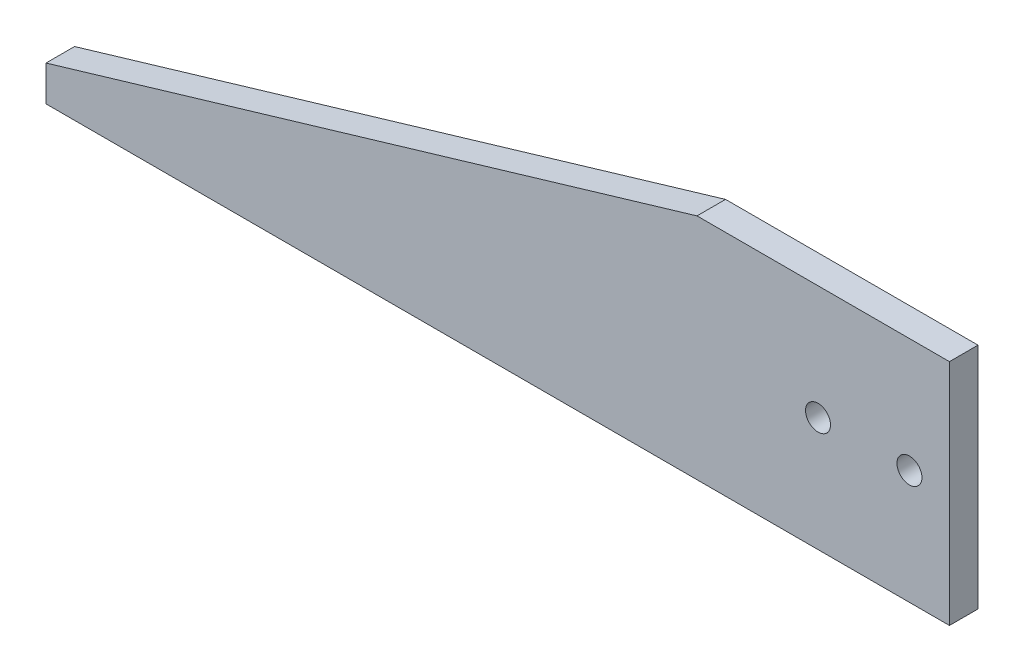
ISO-10303-21;
HEADER;
FILE_DESCRIPTION(('STEP AP214'),'2;1');
FILE_NAME('part.step','',(''),(''),'','','');
FILE_SCHEMA(('AUTOMOTIVE_DESIGN { 1 0 10303 214 1 1 1 1 }'));
ENDSEC;
DATA;
#1=APPLICATION_CONTEXT('core data for automotive mechanical design processes');
#2=APPLICATION_PROTOCOL_DEFINITION('international standard','automotive_design',2000,#1);
#3=PRODUCT_CONTEXT('',#1,'mechanical');
#4=PRODUCT('Part','Part','',(#3));
#5=PRODUCT_RELATED_PRODUCT_CATEGORY('part','',(#4));
#6=PRODUCT_DEFINITION_FORMATION('','',#4);
#7=PRODUCT_DEFINITION_CONTEXT('part definition',#1,'design');
#8=PRODUCT_DEFINITION('design','',#6,#7);
#9=PRODUCT_DEFINITION_SHAPE('','',#8);
#10=(LENGTH_UNIT() NAMED_UNIT(*) SI_UNIT(.MILLI.,.METRE.));
#11=(NAMED_UNIT(*) PLANE_ANGLE_UNIT() SI_UNIT($,.RADIAN.));
#12=(NAMED_UNIT(*) SI_UNIT($,.STERADIAN.) SOLID_ANGLE_UNIT());
#13=UNCERTAINTY_MEASURE_WITH_UNIT(LENGTH_MEASURE(1.E-05),#10,'distance_accuracy_value','');
#14=(GEOMETRIC_REPRESENTATION_CONTEXT(3) GLOBAL_UNCERTAINTY_ASSIGNED_CONTEXT((#13)) GLOBAL_UNIT_ASSIGNED_CONTEXT((#10,
#11,#12)) REPRESENTATION_CONTEXT('',''));
#15=CARTESIAN_POINT('',(0.,0.,0.));
#16=DIRECTION('',(0.,0.,1.));
#17=DIRECTION('',(1.,0.,0.));
#18=AXIS2_PLACEMENT_3D('',#15,#16,#17);
#19=CARTESIAN_POINT('',(-200.836219696139,0.,6.35));
#20=DIRECTION('',(0.,1.,0.));
#21=DIRECTION('',(0.,0.,1.));
#22=AXIS2_PLACEMENT_3D('',#19,#20,#21);
#23=PLANE('',#22);
#24=DIRECTION('',(1.,0.,0.));
#25=VECTOR('',#24,1.);
#26=CARTESIAN_POINT('',(-200.836219696139,0.,0.));
#27=LINE('',#26,#25);
#28=CARTESIAN_POINT('',(-200.836219696139,0.,0.));
#29=VERTEX_POINT('',#28);
#30=CARTESIAN_POINT('',(0.,0.,0.));
#31=VERTEX_POINT('',#30);
#32=EDGE_CURVE('E113',#29,#31,#27,.T.);
#33=ORIENTED_EDGE('',*,*,#32,.T.);
#34=DIRECTION('',(0.,0.,-1.));
#35=VECTOR('',#34,1.);
#36=CARTESIAN_POINT('',(0.,0.,6.35));
#37=LINE('',#36,#35);
#38=CARTESIAN_POINT('',(0.,0.,6.35));
#39=VERTEX_POINT('',#38);
#40=EDGE_CURVE('E11',#39,#31,#37,.T.);
#41=ORIENTED_EDGE('',*,*,#40,.F.);
#42=DIRECTION('',(1.,0.,0.));
#43=VECTOR('',#42,1.);
#44=CARTESIAN_POINT('',(-200.836219696139,0.,6.35));
#45=LINE('',#44,#43);
#46=CARTESIAN_POINT('',(-200.836219696139,0.,6.35));
#47=VERTEX_POINT('',#46);
#48=EDGE_CURVE('E122',#47,#39,#45,.T.);
#49=ORIENTED_EDGE('',*,*,#48,.F.);
#50=DIRECTION('',(0.,0.,-1.));
#51=VECTOR('',#50,1.);
#52=CARTESIAN_POINT('',(-200.836219696139,0.,6.35));
#53=LINE('',#52,#51);
#54=EDGE_CURVE('E109',#47,#29,#53,.T.);
#55=ORIENTED_EDGE('',*,*,#54,.T.);
#56=EDGE_LOOP('',(#33,#41,#49,#55));
#57=FACE_BOUND('',#56,.T.);
#58=ADVANCED_FACE('F39',(#57),#23,.F.);
#59=CARTESIAN_POINT('',(0.,0.,6.35));
#60=DIRECTION('',(-1.,0.,0.));
#61=DIRECTION('',(0.,0.,1.));
#62=AXIS2_PLACEMENT_3D('',#59,#60,#61);
#63=PLANE('',#62);
#64=DIRECTION('',(0.,1.,0.));
#65=VECTOR('',#64,1.);
#66=CARTESIAN_POINT('',(0.,0.,0.));
#67=LINE('',#66,#65);
#68=CARTESIAN_POINT('',(0.,50.8,0.));
#69=VERTEX_POINT('',#68);
#70=EDGE_CURVE('E116',#31,#69,#67,.T.);
#71=ORIENTED_EDGE('',*,*,#70,.T.);
#72=DIRECTION('',(0.,0.,-1.));
#73=VECTOR('',#72,1.);
#74=CARTESIAN_POINT('',(0.,50.8,6.35));
#75=LINE('',#74,#73);
#76=CARTESIAN_POINT('',(0.,50.8,6.35));
#77=VERTEX_POINT('',#76);
#78=EDGE_CURVE('E47',#77,#69,#75,.T.);
#79=ORIENTED_EDGE('',*,*,#78,.F.);
#80=DIRECTION('',(0.,1.,0.));
#81=VECTOR('',#80,1.);
#82=CARTESIAN_POINT('',(0.,0.,6.35));
#83=LINE('',#82,#81);
#84=EDGE_CURVE('E89',#39,#77,#83,.T.);
#85=ORIENTED_EDGE('',*,*,#84,.F.);
#86=ORIENTED_EDGE('',*,*,#40,.T.);
#87=EDGE_LOOP('',(#71,#79,#85,#86));
#88=FACE_BOUND('',#87,.T.);
#89=ADVANCED_FACE('F142',(#88),#63,.F.);
#90=CARTESIAN_POINT('',(0.,50.8,6.35));
#91=DIRECTION('',(0.,-1.,0.));
#92=DIRECTION('',(0.,0.,-1.));
#93=AXIS2_PLACEMENT_3D('',#90,#91,#92);
#94=PLANE('',#93);
#95=DIRECTION('',(-1.,0.,0.));
#96=VECTOR('',#95,1.);
#97=CARTESIAN_POINT('',(0.,50.8,0.));
#98=LINE('',#97,#96);
#99=CARTESIAN_POINT('',(-56.1155095591532,50.8,0.));
#100=VERTEX_POINT('',#99);
#101=EDGE_CURVE('E104',#69,#100,#98,.T.);
#102=ORIENTED_EDGE('',*,*,#101,.T.);
#103=DIRECTION('',(0.,0.,-1.));
#104=VECTOR('',#103,1.);
#105=CARTESIAN_POINT('',(-56.1155095591532,50.8,6.35));
#106=LINE('',#105,#104);
#107=CARTESIAN_POINT('',(-56.1155095591532,50.8,6.35));
#108=VERTEX_POINT('',#107);
#109=EDGE_CURVE('E101',#108,#100,#106,.T.);
#110=ORIENTED_EDGE('',*,*,#109,.F.);
#111=DIRECTION('',(-1.,0.,0.));
#112=VECTOR('',#111,1.);
#113=CARTESIAN_POINT('',(0.,50.8,6.35));
#114=LINE('',#113,#112);
#115=EDGE_CURVE('E93',#77,#108,#114,.T.);
#116=ORIENTED_EDGE('',*,*,#115,.F.);
#117=ORIENTED_EDGE('',*,*,#78,.T.);
#118=EDGE_LOOP('',(#102,#110,#116,#117));
#119=FACE_BOUND('',#118,.T.);
#120=ADVANCED_FACE('F102',(#119),#94,.F.);
#121=CARTESIAN_POINT('',(-56.1155095591532,50.8,6.35));
#122=DIRECTION('',(0.2843946458999,-0.958707299118699,0.));
#123=DIRECTION('',(0.958707299118699,0.2843946458999,0.));
#124=AXIS2_PLACEMENT_3D('',#121,#122,#123);
#125=PLANE('',#124);
#126=DIRECTION('',(-0.958707299118699,-0.2843946458999,0.));
#127=VECTOR('',#126,1.);
#128=CARTESIAN_POINT('',(-56.1155095591532,50.8,0.));
#129=LINE('',#128,#127);
#130=CARTESIAN_POINT('',(-200.836219696139,7.86948809962641,0.));
#131=VERTEX_POINT('',#130);
#132=EDGE_CURVE('E75',#100,#131,#129,.T.);
#133=ORIENTED_EDGE('',*,*,#132,.T.);
#134=DIRECTION('',(0.,0.,-1.));
#135=VECTOR('',#134,1.);
#136=CARTESIAN_POINT('',(-200.836219696139,7.86948809962641,6.35));
#137=LINE('',#136,#135);
#138=CARTESIAN_POINT('',(-200.836219696139,7.86948809962641,6.35));
#139=VERTEX_POINT('',#138);
#140=EDGE_CURVE('E105',#139,#131,#137,.T.);
#141=ORIENTED_EDGE('',*,*,#140,.F.);
#142=DIRECTION('',(-0.958707299118699,-0.2843946458999,0.));
#143=VECTOR('',#142,1.);
#144=CARTESIAN_POINT('',(-56.1155095591532,50.8,6.35));
#145=LINE('',#144,#143);
#146=EDGE_CURVE('E97',#108,#139,#145,.T.);
#147=ORIENTED_EDGE('',*,*,#146,.F.);
#148=ORIENTED_EDGE('',*,*,#109,.T.);
#149=EDGE_LOOP('',(#133,#141,#147,#148));
#150=FACE_BOUND('',#149,.T.);
#151=ADVANCED_FACE('F107',(#150),#125,.F.);
#152=CARTESIAN_POINT('',(-200.836219696139,7.86948809962641,6.35));
#153=DIRECTION('',(1.,0.,0.));
#154=DIRECTION('',(0.,0.,-1.));
#155=AXIS2_PLACEMENT_3D('',#152,#153,#154);
#156=PLANE('',#155);
#157=DIRECTION('',(0.,-1.,0.));
#158=VECTOR('',#157,1.);
#159=CARTESIAN_POINT('',(-200.836219696139,7.86948809962641,0.));
#160=LINE('',#159,#158);
#161=EDGE_CURVE('E81',#131,#29,#160,.T.);
#162=ORIENTED_EDGE('',*,*,#161,.T.);
#163=ORIENTED_EDGE('',*,*,#54,.F.);
#164=DIRECTION('',(0.,-1.,0.));
#165=VECTOR('',#164,1.);
#166=CARTESIAN_POINT('',(-200.836219696139,7.86948809962641,6.35));
#167=LINE('',#166,#165);
#168=EDGE_CURVE('E55',#139,#47,#167,.T.);
#169=ORIENTED_EDGE('',*,*,#168,.F.);
#170=ORIENTED_EDGE('',*,*,#140,.T.);
#171=EDGE_LOOP('',(#162,#163,#169,#170));
#172=FACE_BOUND('',#171,.T.);
#173=ADVANCED_FACE('F130',(#172),#156,.F.);
#174=CARTESIAN_POINT('',(0.,0.,6.35));
#175=DIRECTION('',(0.,0.,1.));
#176=DIRECTION('',(1.,0.,0.));
#177=AXIS2_PLACEMENT_3D('',#174,#175,#176);
#178=PLANE('',#177);
#179=CARTESIAN_POINT('',(-29.21,25.4,6.35));
#180=DIRECTION('',(0.,0.,1.));
#181=DIRECTION('',(1.,0.,0.));
#182=AXIS2_PLACEMENT_3D('',#179,#180,#181);
#183=CIRCLE('',#182,2.778125);
#184=CARTESIAN_POINT('',(-26.431875,25.4,6.35));
#185=VERTEX_POINT('',#184);
#186=EDGE_CURVE('E204',#185,#185,#183,.T.);
#187=ORIENTED_EDGE('',*,*,#186,.F.);
#188=EDGE_LOOP('',(#187));
#189=FACE_BOUND('',#188,.T.);
#190=CARTESIAN_POINT('',(-8.89,25.4,6.35));
#191=DIRECTION('',(0.,0.,1.));
#192=DIRECTION('',(1.,0.,0.));
#193=AXIS2_PLACEMENT_3D('',#190,#191,#192);
#194=CIRCLE('',#193,2.778125);
#195=CARTESIAN_POINT('',(-6.111875,25.4,6.35));
#196=VERTEX_POINT('',#195);
#197=EDGE_CURVE('E205',#196,#196,#194,.T.);
#198=ORIENTED_EDGE('',*,*,#197,.F.);
#199=EDGE_LOOP('',(#198));
#200=FACE_BOUND('',#199,.T.);
#201=ORIENTED_EDGE('',*,*,#48,.T.);
#202=ORIENTED_EDGE('',*,*,#84,.T.);
#203=ORIENTED_EDGE('',*,*,#115,.T.);
#204=ORIENTED_EDGE('',*,*,#146,.T.);
#205=ORIENTED_EDGE('',*,*,#168,.T.);
#206=EDGE_LOOP('',(#201,#202,#203,#204,#205));
#207=FACE_BOUND('',#206,.T.);
#208=ADVANCED_FACE('F95',(#189,#200,#207),#178,.T.);
#209=CARTESIAN_POINT('',(0.,0.,0.));
#210=DIRECTION('',(0.,0.,1.));
#211=DIRECTION('',(1.,0.,0.));
#212=AXIS2_PLACEMENT_3D('',#209,#210,#211);
#213=PLANE('',#212);
#214=CARTESIAN_POINT('',(-29.21,25.4,0.));
#215=DIRECTION('',(0.,0.,1.));
#216=DIRECTION('',(1.,0.,0.));
#217=AXIS2_PLACEMENT_3D('',#214,#215,#216);
#218=CIRCLE('',#217,2.778125);
#219=CARTESIAN_POINT('',(-26.431875,25.4,0.));
#220=VERTEX_POINT('',#219);
#221=EDGE_CURVE('E117',#220,#220,#218,.T.);
#222=ORIENTED_EDGE('',*,*,#221,.T.);
#223=EDGE_LOOP('',(#222));
#224=FACE_BOUND('',#223,.T.);
#225=CARTESIAN_POINT('',(-8.89,25.4,0.));
#226=DIRECTION('',(0.,0.,1.));
#227=DIRECTION('',(1.,0.,0.));
#228=AXIS2_PLACEMENT_3D('',#225,#226,#227);
#229=CIRCLE('',#228,2.778125);
#230=CARTESIAN_POINT('',(-6.111875,25.4,0.));
#231=VERTEX_POINT('',#230);
#232=EDGE_CURVE('E209',#231,#231,#229,.T.);
#233=ORIENTED_EDGE('',*,*,#232,.T.);
#234=EDGE_LOOP('',(#233));
#235=FACE_BOUND('',#234,.T.);
#236=ORIENTED_EDGE('',*,*,#32,.F.);
#237=ORIENTED_EDGE('',*,*,#161,.F.);
#238=ORIENTED_EDGE('',*,*,#132,.F.);
#239=ORIENTED_EDGE('',*,*,#101,.F.);
#240=ORIENTED_EDGE('',*,*,#70,.F.);
#241=EDGE_LOOP('',(#236,#237,#238,#239,#240));
#242=FACE_BOUND('',#241,.T.);
#243=ADVANCED_FACE('F126',(#224,#235,#242),#213,.F.);
#244=CARTESIAN_POINT('',(-8.89,25.4,0.));
#245=DIRECTION('',(0.,0.,1.));
#246=DIRECTION('',(1.,0.,0.));
#247=AXIS2_PLACEMENT_3D('',#244,#245,#246);
#248=CYLINDRICAL_SURFACE('',#247,2.778125);
#249=ORIENTED_EDGE('',*,*,#232,.F.);
#250=EDGE_LOOP('',(#249));
#251=FACE_BOUND('',#250,.T.);
#252=ORIENTED_EDGE('',*,*,#197,.T.);
#253=EDGE_LOOP('',(#252));
#254=FACE_BOUND('',#253,.T.);
#255=ADVANCED_FACE('F177',(#251,#254),#248,.F.);
#256=CARTESIAN_POINT('',(-29.21,25.4,0.));
#257=DIRECTION('',(0.,0.,1.));
#258=DIRECTION('',(1.,0.,0.));
#259=AXIS2_PLACEMENT_3D('',#256,#257,#258);
#260=CYLINDRICAL_SURFACE('',#259,2.778125);
#261=ORIENTED_EDGE('',*,*,#221,.F.);
#262=EDGE_LOOP('',(#261));
#263=FACE_BOUND('',#262,.T.);
#264=ORIENTED_EDGE('',*,*,#186,.T.);
#265=EDGE_LOOP('',(#264));
#266=FACE_BOUND('',#265,.T.);
#267=ADVANCED_FACE('F186',(#263,#266),#260,.F.);
#268=CLOSED_SHELL('',(#58,#89,#120,#151,#173,#208,#243,#255,#267));
#269=MANIFOLD_SOLID_BREP('B2',#268);
#270=ADVANCED_BREP_SHAPE_REPRESENTATION('',(#18,#269),#14);
#271=SHAPE_DEFINITION_REPRESENTATION(#9,#270);
ENDSEC;
END-ISO-10303-21;
